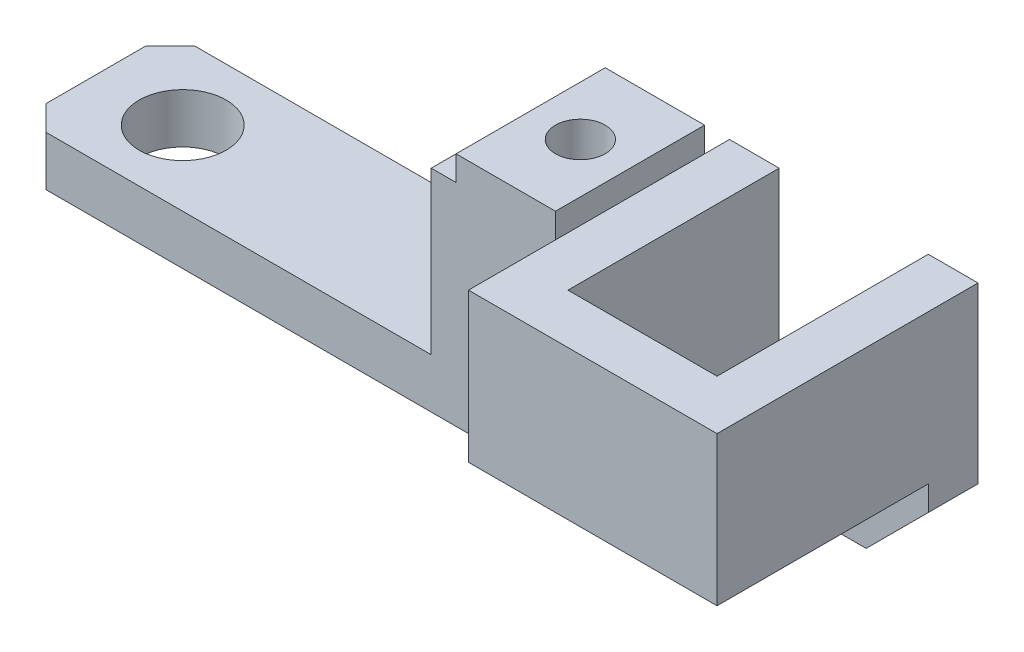
ISO-10303-21;
HEADER;
FILE_DESCRIPTION(('STEP AP214'),'2;1');
FILE_NAME('part.step','',(''),(''),'','','');
FILE_SCHEMA(('AUTOMOTIVE_DESIGN { 1 0 10303 214 1 1 1 1 }'));
ENDSEC;
DATA;
#1=APPLICATION_CONTEXT('core data for automotive mechanical design processes');
#2=APPLICATION_PROTOCOL_DEFINITION('international standard','automotive_design',2000,#1);
#3=PRODUCT_CONTEXT('',#1,'mechanical');
#4=PRODUCT('Part','Part','',(#3));
#5=PRODUCT_RELATED_PRODUCT_CATEGORY('part','',(#4));
#6=PRODUCT_DEFINITION_FORMATION('','',#4);
#7=PRODUCT_DEFINITION_CONTEXT('part definition',#1,'design');
#8=PRODUCT_DEFINITION('design','',#6,#7);
#9=PRODUCT_DEFINITION_SHAPE('','',#8);
#10=(LENGTH_UNIT() NAMED_UNIT(*) SI_UNIT(.MILLI.,.METRE.));
#11=(NAMED_UNIT(*) PLANE_ANGLE_UNIT() SI_UNIT($,.RADIAN.));
#12=(NAMED_UNIT(*) SI_UNIT($,.STERADIAN.) SOLID_ANGLE_UNIT());
#13=UNCERTAINTY_MEASURE_WITH_UNIT(LENGTH_MEASURE(1.E-05),#10,'distance_accuracy_value','');
#14=(GEOMETRIC_REPRESENTATION_CONTEXT(3) GLOBAL_UNCERTAINTY_ASSIGNED_CONTEXT((#13)) GLOBAL_UNIT_ASSIGNED_CONTEXT((#10,
#11,#12)) REPRESENTATION_CONTEXT('',''));
#15=CARTESIAN_POINT('',(0.,0.,0.));
#16=DIRECTION('',(0.,0.,1.));
#17=DIRECTION('',(1.,0.,0.));
#18=AXIS2_PLACEMENT_3D('',#15,#16,#17);
#19=CARTESIAN_POINT('',(0.,4.,-6.));
#20=DIRECTION('',(0.,0.,-1.));
#21=DIRECTION('',(-1.,0.,0.));
#22=AXIS2_PLACEMENT_3D('',#19,#20,#21);
#23=PLANE('',#22);
#24=CARTESIAN_POINT('',(32.5,4.,-6.));
#25=DIRECTION('',(0.,0.,1.));
#26=DIRECTION('',(1.,0.,0.));
#27=AXIS2_PLACEMENT_3D('',#24,#25,#26);
#28=CIRCLE('',#27,1.5);
#29=CARTESIAN_POINT('',(34.,4.,-6.));
#30=VERTEX_POINT('',#29);
#31=EDGE_CURVE('E433',#30,#30,#28,.T.);
#32=ORIENTED_EDGE('',*,*,#31,.T.);
#33=EDGE_LOOP('',(#32));
#34=FACE_BOUND('',#33,.T.);
#35=DIRECTION('',(0.,-1.,0.));
#36=VECTOR('',#35,1.);
#37=CARTESIAN_POINT('',(42.5,7.,-6.));
#38=LINE('',#37,#36);
#39=CARTESIAN_POINT('',(42.5,19.,-6.));
#40=VERTEX_POINT('',#39);
#41=CARTESIAN_POINT('',(42.5,4.99999999999995,-6.));
#42=VERTEX_POINT('',#41);
#43=EDGE_CURVE('E215',#40,#42,#38,.T.);
#44=ORIENTED_EDGE('',*,*,#43,.T.);
#45=DIRECTION('',(-0.707106781186552,-0.707106781186544,0.));
#46=VECTOR('',#45,1.);
#47=CARTESIAN_POINT('',(18.7499999999998,-18.75,-6.));
#48=LINE('',#47,#46);
#49=CARTESIAN_POINT('',(37.5,0.,-6.));
#50=VERTEX_POINT('',#49);
#51=EDGE_CURVE('E203',#42,#50,#48,.T.);
#52=ORIENTED_EDGE('',*,*,#51,.T.);
#53=DIRECTION('',(1.,0.,0.));
#54=VECTOR('',#53,1.);
#55=CARTESIAN_POINT('',(0.,0.,-6.));
#56=LINE('',#55,#54);
#57=CARTESIAN_POINT('',(-20.5,0.,-6.));
#58=VERTEX_POINT('',#57);
#59=EDGE_CURVE('E302',#58,#50,#56,.T.);
#60=ORIENTED_EDGE('',*,*,#59,.F.);
#61=DIRECTION('',(0.,1.,0.));
#62=VECTOR('',#61,1.);
#63=CARTESIAN_POINT('',(-20.5,4.,-6.));
#64=LINE('',#63,#62);
#65=CARTESIAN_POINT('',(-20.5,4.,-6.));
#66=VERTEX_POINT('',#65);
#67=EDGE_CURVE('E11',#58,#66,#64,.T.);
#68=ORIENTED_EDGE('',*,*,#67,.T.);
#69=DIRECTION('',(1.,0.,0.));
#70=VECTOR('',#69,1.);
#71=CARTESIAN_POINT('',(0.,4.,-6.));
#72=LINE('',#71,#70);
#73=CARTESIAN_POINT('',(10.5,4.,-6.));
#74=VERTEX_POINT('',#73);
#75=EDGE_CURVE('E294',#66,#74,#72,.T.);
#76=ORIENTED_EDGE('',*,*,#75,.T.);
#77=DIRECTION('',(0.,-1.,0.));
#78=VECTOR('',#77,1.);
#79=CARTESIAN_POINT('',(10.5,17.,-6.));
#80=LINE('',#79,#78);
#81=CARTESIAN_POINT('',(10.5,17.,-6.));
#82=VERTEX_POINT('',#81);
#83=EDGE_CURVE('E285',#82,#74,#80,.T.);
#84=ORIENTED_EDGE('',*,*,#83,.F.);
#85=DIRECTION('',(1.,0.,0.));
#86=VECTOR('',#85,1.);
#87=CARTESIAN_POINT('',(0.,17.,-6.));
#88=LINE('',#87,#86);
#89=CARTESIAN_POINT('',(12.5,17.,-6.));
#90=VERTEX_POINT('',#89);
#91=EDGE_CURVE('E271',#82,#90,#88,.T.);
#92=ORIENTED_EDGE('',*,*,#91,.T.);
#93=DIRECTION('',(0.,-1.,0.));
#94=VECTOR('',#93,1.);
#95=CARTESIAN_POINT('',(12.5,19.,-6.));
#96=LINE('',#95,#94);
#97=CARTESIAN_POINT('',(12.5,19.,-6.));
#98=VERTEX_POINT('',#97);
#99=EDGE_CURVE('E268',#98,#90,#96,.T.);
#100=ORIENTED_EDGE('',*,*,#99,.F.);
#101=DIRECTION('',(1.,0.,0.));
#102=VECTOR('',#101,1.);
#103=CARTESIAN_POINT('',(0.,19.,-6.));
#104=LINE('',#103,#102);
#105=CARTESIAN_POINT('',(20.5,19.,-6.));
#106=VERTEX_POINT('',#105);
#107=EDGE_CURVE('E250',#98,#106,#104,.T.);
#108=ORIENTED_EDGE('',*,*,#107,.T.);
#109=DIRECTION('',(0.,-1.,0.));
#110=VECTOR('',#109,1.);
#111=CARTESIAN_POINT('',(20.5,19.,-6.));
#112=LINE('',#111,#110);
#113=CARTESIAN_POINT('',(20.5,17.,-6.));
#114=VERTEX_POINT('',#113);
#115=EDGE_CURVE('E256',#106,#114,#112,.T.);
#116=ORIENTED_EDGE('',*,*,#115,.T.);
#117=DIRECTION('',(1.,0.,0.));
#118=VECTOR('',#117,1.);
#119=CARTESIAN_POINT('',(0.,17.,-6.));
#120=LINE('',#119,#118);
#121=CARTESIAN_POINT('',(22.5,17.,-6.));
#122=VERTEX_POINT('',#121);
#123=EDGE_CURVE('E231',#114,#122,#120,.T.);
#124=ORIENTED_EDGE('',*,*,#123,.T.);
#125=DIRECTION('',(0.,-1.,0.));
#126=VECTOR('',#125,1.);
#127=CARTESIAN_POINT('',(22.5,48.,-6.));
#128=LINE('',#127,#126);
#129=CARTESIAN_POINT('',(22.5,19.,-6.));
#130=VERTEX_POINT('',#129);
#131=EDGE_CURVE('E399',#130,#122,#128,.T.);
#132=ORIENTED_EDGE('',*,*,#131,.F.);
#133=DIRECTION('',(-1.,0.,0.));
#134=VECTOR('',#133,1.);
#135=CARTESIAN_POINT('',(22.5,19.,-6.));
#136=LINE('',#135,#134);
#137=CARTESIAN_POINT('',(26.5,19.,-6.));
#138=VERTEX_POINT('',#137);
#139=EDGE_CURVE('E418',#138,#130,#136,.T.);
#140=ORIENTED_EDGE('',*,*,#139,.F.);
#141=DIRECTION('',(0.,-1.,0.));
#142=VECTOR('',#141,1.);
#143=CARTESIAN_POINT('',(26.5,48.,-6.));
#144=LINE('',#143,#142);
#145=CARTESIAN_POINT('',(26.5,7.,-6.));
#146=VERTEX_POINT('',#145);
#147=EDGE_CURVE('E420',#138,#146,#144,.T.);
#148=ORIENTED_EDGE('',*,*,#147,.T.);
#149=DIRECTION('',(1.,0.,0.));
#150=VECTOR('',#149,1.);
#151=CARTESIAN_POINT('',(0.,7.,-6.));
#152=LINE('',#151,#150);
#153=CARTESIAN_POINT('',(38.5,7.,-6.));
#154=VERTEX_POINT('',#153);
#155=EDGE_CURVE('E352',#146,#154,#152,.T.);
#156=ORIENTED_EDGE('',*,*,#155,.T.);
#157=DIRECTION('',(0.,-1.,0.));
#158=VECTOR('',#157,1.);
#159=CARTESIAN_POINT('',(38.5,48.,-6.));
#160=LINE('',#159,#158);
#161=CARTESIAN_POINT('',(38.5,19.,-6.));
#162=VERTEX_POINT('',#161);
#163=EDGE_CURVE('E387',#162,#154,#160,.T.);
#164=ORIENTED_EDGE('',*,*,#163,.F.);
#165=DIRECTION('',(-1.,0.,0.));
#166=VECTOR('',#165,1.);
#167=CARTESIAN_POINT('',(38.5,19.,-6.));
#168=LINE('',#167,#166);
#169=EDGE_CURVE('E218',#40,#162,#168,.T.);
#170=ORIENTED_EDGE('',*,*,#169,.F.);
#171=EDGE_LOOP('',(#44,#52,#60,#68,#76,#84,#92,#100,#108,#116,#124,#132,#140,#148,#156,#164,#170));
#172=FACE_BOUND('',#171,.T.);
#173=ADVANCED_FACE('F44',(#34,#172),#23,.T.);
#174=CARTESIAN_POINT('',(0.,7.,-2.));
#175=DIRECTION('',(0.,0.,-1.));
#176=DIRECTION('',(-1.,0.,0.));
#177=AXIS2_PLACEMENT_3D('',#174,#175,#176);
#178=PLANE('',#177);
#179=CARTESIAN_POINT('',(32.5,4.,-2.));
#180=DIRECTION('',(0.,0.,1.));
#181=DIRECTION('',(1.,0.,0.));
#182=AXIS2_PLACEMENT_3D('',#179,#180,#181);
#183=CIRCLE('',#182,1.5);
#184=CARTESIAN_POINT('',(34.,4.,-2.));
#185=VERTEX_POINT('',#184);
#186=EDGE_CURVE('E348',#185,#185,#183,.T.);
#187=ORIENTED_EDGE('',*,*,#186,.F.);
#188=EDGE_LOOP('',(#187));
#189=FACE_BOUND('',#188,.T.);
#190=DIRECTION('',(-0.707106781186552,-0.707106781186544,0.));
#191=VECTOR('',#190,1.);
#192=CARTESIAN_POINT('',(18.7499999999998,-18.75,-2.));
#193=LINE('',#192,#191);
#194=CARTESIAN_POINT('',(42.5,4.99999999999995,-2.));
#195=VERTEX_POINT('',#194);
#196=CARTESIAN_POINT('',(37.5,0.,-2.));
#197=VERTEX_POINT('',#196);
#198=EDGE_CURVE('E210',#195,#197,#193,.T.);
#199=ORIENTED_EDGE('',*,*,#198,.F.);
#200=DIRECTION('',(0.,-1.,0.));
#201=VECTOR('',#200,1.);
#202=CARTESIAN_POINT('',(42.5,7.,-2.));
#203=LINE('',#202,#201);
#204=CARTESIAN_POINT('',(42.5,7.,-2.));
#205=VERTEX_POINT('',#204);
#206=EDGE_CURVE('E214',#205,#195,#203,.T.);
#207=ORIENTED_EDGE('',*,*,#206,.F.);
#208=DIRECTION('',(1.,0.,0.));
#209=VECTOR('',#208,1.);
#210=CARTESIAN_POINT('',(0.,7.,-2.));
#211=LINE('',#210,#209);
#212=CARTESIAN_POINT('',(38.5,7.,-2.));
#213=VERTEX_POINT('',#212);
#214=EDGE_CURVE('E357',#213,#205,#211,.T.);
#215=ORIENTED_EDGE('',*,*,#214,.F.);
#216=CARTESIAN_POINT('',(26.5,7.,-2.));
#217=VERTEX_POINT('',#216);
#218=EDGE_CURVE('E370',#217,#213,#211,.T.);
#219=ORIENTED_EDGE('',*,*,#218,.F.);
#220=CARTESIAN_POINT('',(22.5,7.,-2.));
#221=VERTEX_POINT('',#220);
#222=EDGE_CURVE('E364',#221,#217,#211,.T.);
#223=ORIENTED_EDGE('',*,*,#222,.F.);
#224=DIRECTION('',(0.,-1.,0.));
#225=VECTOR('',#224,1.);
#226=CARTESIAN_POINT('',(22.5,7.,-2.));
#227=LINE('',#226,#225);
#228=CARTESIAN_POINT('',(22.5,0.,-2.));
#229=VERTEX_POINT('',#228);
#230=EDGE_CURVE('E225',#221,#229,#227,.T.);
#231=ORIENTED_EDGE('',*,*,#230,.T.);
#232=DIRECTION('',(1.,0.,0.));
#233=VECTOR('',#232,1.);
#234=CARTESIAN_POINT('',(0.,0.,-2.));
#235=LINE('',#234,#233);
#236=EDGE_CURVE('E349',#229,#197,#235,.T.);
#237=ORIENTED_EDGE('',*,*,#236,.T.);
#238=EDGE_LOOP('',(#199,#207,#215,#219,#223,#231,#237));
#239=FACE_BOUND('',#238,.T.);
#240=ADVANCED_FACE('F355',(#189,#239),#178,.F.);
#241=CARTESIAN_POINT('',(22.5,17.,0.));
#242=DIRECTION('',(-1.,0.,0.));
#243=DIRECTION('',(0.,0.,1.));
#244=AXIS2_PLACEMENT_3D('',#241,#242,#243);
#245=PLANE('',#244);
#246=ORIENTED_EDGE('',*,*,#230,.F.);
#247=DIRECTION('',(0.,0.,1.));
#248=VECTOR('',#247,1.);
#249=CARTESIAN_POINT('',(22.5,7.,-6.));
#250=LINE('',#249,#248);
#251=CARTESIAN_POINT('',(22.5,7.,6.));
#252=VERTEX_POINT('',#251);
#253=EDGE_CURVE('E397',#221,#252,#250,.T.);
#254=ORIENTED_EDGE('',*,*,#253,.T.);
#255=DIRECTION('',(0.,-1.,0.));
#256=VECTOR('',#255,1.);
#257=CARTESIAN_POINT('',(22.5,17.,6.));
#258=LINE('',#257,#256);
#259=CARTESIAN_POINT('',(22.5,0.,6.));
#260=VERTEX_POINT('',#259);
#261=EDGE_CURVE('E236',#252,#260,#258,.T.);
#262=ORIENTED_EDGE('',*,*,#261,.T.);
#263=DIRECTION('',(0.,0.,-1.));
#264=VECTOR('',#263,1.);
#265=CARTESIAN_POINT('',(22.5,0.,0.));
#266=LINE('',#265,#264);
#267=EDGE_CURVE('E222',#260,#229,#266,.T.);
#268=ORIENTED_EDGE('',*,*,#267,.T.);
#269=EDGE_LOOP('',(#246,#254,#262,#268));
#270=FACE_BOUND('',#269,.T.);
#271=ADVANCED_FACE('F472',(#270),#245,.F.);
#272=CARTESIAN_POINT('',(-22.5,4.,0.));
#273=DIRECTION('',(-1.,0.,0.));
#274=DIRECTION('',(0.,0.,1.));
#275=AXIS2_PLACEMENT_3D('',#272,#273,#274);
#276=PLANE('',#275);
#277=DIRECTION('',(0.,0.,-1.));
#278=VECTOR('',#277,1.);
#279=CARTESIAN_POINT('',(-22.5,0.,0.));
#280=LINE('',#279,#278);
#281=CARTESIAN_POINT('',(-22.5,0.,3.99999999999999));
#282=VERTEX_POINT('',#281);
#283=CARTESIAN_POINT('',(-22.5,0.,-3.99999999999999));
#284=VERTEX_POINT('',#283);
#285=EDGE_CURVE('E308',#282,#284,#280,.T.);
#286=ORIENTED_EDGE('',*,*,#285,.F.);
#287=DIRECTION('',(0.,1.,0.));
#288=VECTOR('',#287,1.);
#289=CARTESIAN_POINT('',(-22.5,4.,3.99999999999999));
#290=LINE('',#289,#288);
#291=CARTESIAN_POINT('',(-22.5,4.,3.99999999999999));
#292=VERTEX_POINT('',#291);
#293=EDGE_CURVE('E317',#282,#292,#290,.T.);
#294=ORIENTED_EDGE('',*,*,#293,.T.);
#295=DIRECTION('',(0.,0.,-1.));
#296=VECTOR('',#295,1.);
#297=CARTESIAN_POINT('',(-22.5,4.,0.));
#298=LINE('',#297,#296);
#299=CARTESIAN_POINT('',(-22.5,4.,-3.99999999999999));
#300=VERTEX_POINT('',#299);
#301=EDGE_CURVE('E299',#292,#300,#298,.T.);
#302=ORIENTED_EDGE('',*,*,#301,.T.);
#303=DIRECTION('',(0.,-1.,0.));
#304=VECTOR('',#303,1.);
#305=CARTESIAN_POINT('',(-22.5,4.,-3.99999999999999));
#306=LINE('',#305,#304);
#307=EDGE_CURVE('E316',#300,#284,#306,.T.);
#308=ORIENTED_EDGE('',*,*,#307,.T.);
#309=EDGE_LOOP('',(#286,#294,#302,#308));
#310=FACE_BOUND('',#309,.T.);
#311=ADVANCED_FACE('F341',(#310),#276,.T.);
#312=CARTESIAN_POINT('',(-15.5,4.,0.));
#313=DIRECTION('',(0.,-1.,0.));
#314=DIRECTION('',(0.,0.,-1.));
#315=AXIS2_PLACEMENT_3D('',#312,#313,#314);
#316=CYLINDRICAL_SURFACE('',#315,3.5);
#317=CARTESIAN_POINT('',(-15.5,4.,0.));
#318=DIRECTION('',(0.,1.,0.));
#319=DIRECTION('',(0.,0.,1.));
#320=AXIS2_PLACEMENT_3D('',#317,#318,#319);
#321=CIRCLE('',#320,3.5);
#322=CARTESIAN_POINT('',(-15.5,4.,3.5));
#323=VERTEX_POINT('',#322);
#324=EDGE_CURVE('E290',#323,#323,#321,.T.);
#325=ORIENTED_EDGE('',*,*,#324,.T.);
#326=EDGE_LOOP('',(#325));
#327=FACE_BOUND('',#326,.T.);
#328=CARTESIAN_POINT('',(-15.5,0.,0.));
#329=DIRECTION('',(0.,1.,0.));
#330=DIRECTION('',(0.,0.,1.));
#331=AXIS2_PLACEMENT_3D('',#328,#329,#330);
#332=CIRCLE('',#331,3.5);
#333=CARTESIAN_POINT('',(-15.5,0.,3.5));
#334=VERTEX_POINT('',#333);
#335=EDGE_CURVE('E288',#334,#334,#332,.T.);
#336=ORIENTED_EDGE('',*,*,#335,.F.);
#337=EDGE_LOOP('',(#336));
#338=FACE_BOUND('',#337,.T.);
#339=ADVANCED_FACE('F477',(#327,#338),#316,.F.);
#340=CARTESIAN_POINT('',(0.,4.,6.));
#341=DIRECTION('',(0.,0.,-1.));
#342=DIRECTION('',(-1.,0.,0.));
#343=AXIS2_PLACEMENT_3D('',#340,#341,#342);
#344=PLANE('',#343);
#345=DIRECTION('',(1.,0.,0.));
#346=VECTOR('',#345,1.);
#347=CARTESIAN_POINT('',(0.,4.,6.));
#348=LINE('',#347,#346);
#349=CARTESIAN_POINT('',(-20.5,4.,6.));
#350=VERTEX_POINT('',#349);
#351=CARTESIAN_POINT('',(10.5,4.,6.));
#352=VERTEX_POINT('',#351);
#353=EDGE_CURVE('E298',#350,#352,#348,.T.);
#354=ORIENTED_EDGE('',*,*,#353,.F.);
#355=DIRECTION('',(0.,-1.,0.));
#356=VECTOR('',#355,1.);
#357=CARTESIAN_POINT('',(-20.5,0.,6.));
#358=LINE('',#357,#356);
#359=CARTESIAN_POINT('',(-20.5,0.,6.));
#360=VERTEX_POINT('',#359);
#361=EDGE_CURVE('E303',#350,#360,#358,.T.);
#362=ORIENTED_EDGE('',*,*,#361,.T.);
#363=DIRECTION('',(1.,0.,0.));
#364=VECTOR('',#363,1.);
#365=CARTESIAN_POINT('',(0.,0.,6.));
#366=LINE('',#365,#364);
#367=EDGE_CURVE('E292',#360,#260,#366,.T.);
#368=ORIENTED_EDGE('',*,*,#367,.T.);
#369=ORIENTED_EDGE('',*,*,#261,.F.);
#370=CARTESIAN_POINT('',(22.5,17.,6.));
#371=VERTEX_POINT('',#370);
#372=EDGE_CURVE('E238',#371,#252,#258,.T.);
#373=ORIENTED_EDGE('',*,*,#372,.F.);
#374=DIRECTION('',(1.,0.,0.));
#375=VECTOR('',#374,1.);
#376=CARTESIAN_POINT('',(0.,17.,6.));
#377=LINE('',#376,#375);
#378=CARTESIAN_POINT('',(20.5,17.,6.));
#379=VERTEX_POINT('',#378);
#380=EDGE_CURVE('E223',#379,#371,#377,.T.);
#381=ORIENTED_EDGE('',*,*,#380,.F.);
#382=DIRECTION('',(0.,-1.,0.));
#383=VECTOR('',#382,1.);
#384=CARTESIAN_POINT('',(20.5,19.,6.));
#385=LINE('',#384,#383);
#386=CARTESIAN_POINT('',(20.5,19.,6.));
#387=VERTEX_POINT('',#386);
#388=EDGE_CURVE('E263',#387,#379,#385,.T.);
#389=ORIENTED_EDGE('',*,*,#388,.F.);
#390=DIRECTION('',(1.,0.,0.));
#391=VECTOR('',#390,1.);
#392=CARTESIAN_POINT('',(0.,19.,6.));
#393=LINE('',#392,#391);
#394=CARTESIAN_POINT('',(12.5,19.,6.));
#395=VERTEX_POINT('',#394);
#396=EDGE_CURVE('E251',#395,#387,#393,.T.);
#397=ORIENTED_EDGE('',*,*,#396,.F.);
#398=DIRECTION('',(0.,-1.,0.));
#399=VECTOR('',#398,1.);
#400=CARTESIAN_POINT('',(12.5,19.,6.));
#401=LINE('',#400,#399);
#402=CARTESIAN_POINT('',(12.5,17.,6.));
#403=VERTEX_POINT('',#402);
#404=EDGE_CURVE('E264',#395,#403,#401,.T.);
#405=ORIENTED_EDGE('',*,*,#404,.T.);
#406=DIRECTION('',(1.,0.,0.));
#407=VECTOR('',#406,1.);
#408=CARTESIAN_POINT('',(0.,17.,6.));
#409=LINE('',#408,#407);
#410=CARTESIAN_POINT('',(10.5,17.,6.));
#411=VERTEX_POINT('',#410);
#412=EDGE_CURVE('E274',#411,#403,#409,.T.);
#413=ORIENTED_EDGE('',*,*,#412,.F.);
#414=DIRECTION('',(0.,-1.,0.));
#415=VECTOR('',#414,1.);
#416=CARTESIAN_POINT('',(10.5,17.,6.));
#417=LINE('',#416,#415);
#418=EDGE_CURVE('E278',#411,#352,#417,.T.);
#419=ORIENTED_EDGE('',*,*,#418,.T.);
#420=EDGE_LOOP('',(#354,#362,#368,#369,#373,#381,#389,#397,#405,#413,#419));
#421=FACE_BOUND('',#420,.T.);
#422=ADVANCED_FACE('F335',(#421),#344,.F.);
#423=CARTESIAN_POINT('',(0.,4.,0.));
#424=DIRECTION('',(0.,1.,0.));
#425=DIRECTION('',(0.,0.,1.));
#426=AXIS2_PLACEMENT_3D('',#423,#424,#425);
#427=PLANE('',#426);
#428=ORIENTED_EDGE('',*,*,#324,.F.);
#429=EDGE_LOOP('',(#428));
#430=FACE_BOUND('',#429,.T.);
#431=ORIENTED_EDGE('',*,*,#301,.F.);
#432=DIRECTION('',(0.707106781186546,0.,0.707106781186549));
#433=VECTOR('',#432,1.);
#434=CARTESIAN_POINT('',(-13.25,4.,13.25));
#435=LINE('',#434,#433);
#436=EDGE_CURVE('E53',#292,#350,#435,.T.);
#437=ORIENTED_EDGE('',*,*,#436,.T.);
#438=ORIENTED_EDGE('',*,*,#353,.T.);
#439=DIRECTION('',(0.,0.,1.));
#440=VECTOR('',#439,1.);
#441=CARTESIAN_POINT('',(10.5,4.,0.));
#442=LINE('',#441,#440);
#443=EDGE_CURVE('E289',#74,#352,#442,.T.);
#444=ORIENTED_EDGE('',*,*,#443,.F.);
#445=ORIENTED_EDGE('',*,*,#75,.F.);
#446=DIRECTION('',(0.707106781186549,0.,-0.707106781186546));
#447=VECTOR('',#446,1.);
#448=CARTESIAN_POINT('',(-13.25,4.,-13.25));
#449=LINE('',#448,#447);
#450=EDGE_CURVE('E321',#66,#300,#449,.F.);
#451=ORIENTED_EDGE('',*,*,#450,.T.);
#452=EDGE_LOOP('',(#431,#437,#438,#444,#445,#451));
#453=FACE_BOUND('',#452,.T.);
#454=ADVANCED_FACE('F326',(#430,#453),#427,.T.);
#455=CARTESIAN_POINT('',(0.,0.,0.));
#456=DIRECTION('',(0.,1.,0.));
#457=DIRECTION('',(0.,0.,1.));
#458=AXIS2_PLACEMENT_3D('',#455,#456,#457);
#459=PLANE('',#458);
#460=ORIENTED_EDGE('',*,*,#335,.T.);
#461=EDGE_LOOP('',(#460));
#462=FACE_BOUND('',#461,.T.);
#463=ORIENTED_EDGE('',*,*,#59,.T.);
#464=DIRECTION('',(0.,0.,1.));
#465=VECTOR('',#464,1.);
#466=CARTESIAN_POINT('',(37.5,0.,-6.));
#467=LINE('',#466,#465);
#468=EDGE_CURVE('E204',#50,#197,#467,.T.);
#469=ORIENTED_EDGE('',*,*,#468,.T.);
#470=ORIENTED_EDGE('',*,*,#236,.F.);
#471=ORIENTED_EDGE('',*,*,#267,.F.);
#472=ORIENTED_EDGE('',*,*,#367,.F.);
#473=DIRECTION('',(-0.707106781186546,0.,-0.707106781186549));
#474=VECTOR('',#473,1.);
#475=CARTESIAN_POINT('',(-20.5,0.,6.));
#476=LINE('',#475,#474);
#477=EDGE_CURVE('E314',#360,#282,#476,.T.);
#478=ORIENTED_EDGE('',*,*,#477,.T.);
#479=ORIENTED_EDGE('',*,*,#285,.T.);
#480=DIRECTION('',(-0.707106781186549,0.,0.707106781186546));
#481=VECTOR('',#480,1.);
#482=CARTESIAN_POINT('',(-22.5,0.,-3.99999999999999));
#483=LINE('',#482,#481);
#484=EDGE_CURVE('E315',#284,#58,#483,.F.);
#485=ORIENTED_EDGE('',*,*,#484,.T.);
#486=EDGE_LOOP('',(#463,#469,#470,#471,#472,#478,#479,#485));
#487=FACE_BOUND('',#486,.T.);
#488=CARTESIAN_POINT('',(16.5,0.,0.));
#489=DIRECTION('',(0.,1.,0.));
#490=DIRECTION('',(0.,0.,1.));
#491=AXIS2_PLACEMENT_3D('',#488,#489,#490);
#492=CIRCLE('',#491,2.);
#493=CARTESIAN_POINT('',(16.5,0.,2.));
#494=VERTEX_POINT('',#493);
#495=EDGE_CURVE('E245',#494,#494,#492,.T.);
#496=ORIENTED_EDGE('',*,*,#495,.T.);
#497=EDGE_LOOP('',(#496));
#498=FACE_BOUND('',#497,.T.);
#499=ADVANCED_FACE('F338',(#462,#487,#498),#459,.F.);
#500=CARTESIAN_POINT('',(10.5,17.,0.));
#501=DIRECTION('',(1.,0.,0.));
#502=DIRECTION('',(0.,0.,-1.));
#503=AXIS2_PLACEMENT_3D('',#500,#501,#502);
#504=PLANE('',#503);
#505=ORIENTED_EDGE('',*,*,#83,.T.);
#506=ORIENTED_EDGE('',*,*,#443,.T.);
#507=ORIENTED_EDGE('',*,*,#418,.F.);
#508=DIRECTION('',(0.,0.,1.));
#509=VECTOR('',#508,1.);
#510=CARTESIAN_POINT('',(10.5,17.,0.));
#511=LINE('',#510,#509);
#512=EDGE_CURVE('E272',#82,#411,#511,.T.);
#513=ORIENTED_EDGE('',*,*,#512,.F.);
#514=EDGE_LOOP('',(#505,#506,#507,#513));
#515=FACE_BOUND('',#514,.T.);
#516=ADVANCED_FACE('F540',(#515),#504,.F.);
#517=CARTESIAN_POINT('',(0.,17.,0.));
#518=DIRECTION('',(0.,1.,0.));
#519=DIRECTION('',(0.,0.,1.));
#520=AXIS2_PLACEMENT_3D('',#517,#518,#519);
#521=PLANE('',#520);
#522=ORIENTED_EDGE('',*,*,#91,.F.);
#523=ORIENTED_EDGE('',*,*,#512,.T.);
#524=ORIENTED_EDGE('',*,*,#412,.T.);
#525=DIRECTION('',(0.,0.,1.));
#526=VECTOR('',#525,1.);
#527=CARTESIAN_POINT('',(12.5,17.,0.));
#528=LINE('',#527,#526);
#529=EDGE_CURVE('E280',#90,#403,#528,.T.);
#530=ORIENTED_EDGE('',*,*,#529,.F.);
#531=EDGE_LOOP('',(#522,#523,#524,#530));
#532=FACE_BOUND('',#531,.T.);
#533=ADVANCED_FACE('F534',(#532),#521,.T.);
#534=CARTESIAN_POINT('',(12.5,19.,0.));
#535=DIRECTION('',(1.,0.,0.));
#536=DIRECTION('',(0.,0.,-1.));
#537=AXIS2_PLACEMENT_3D('',#534,#535,#536);
#538=PLANE('',#537);
#539=ORIENTED_EDGE('',*,*,#99,.T.);
#540=ORIENTED_EDGE('',*,*,#529,.T.);
#541=ORIENTED_EDGE('',*,*,#404,.F.);
#542=DIRECTION('',(0.,0.,1.));
#543=VECTOR('',#542,1.);
#544=CARTESIAN_POINT('',(12.5,19.,0.));
#545=LINE('',#544,#543);
#546=EDGE_CURVE('E249',#98,#395,#545,.T.);
#547=ORIENTED_EDGE('',*,*,#546,.F.);
#548=EDGE_LOOP('',(#539,#540,#541,#547));
#549=FACE_BOUND('',#548,.T.);
#550=ADVANCED_FACE('F529',(#549),#538,.F.);
#551=CARTESIAN_POINT('',(16.5,19.,0.));
#552=DIRECTION('',(0.,-1.,0.));
#553=DIRECTION('',(0.,0.,-1.));
#554=AXIS2_PLACEMENT_3D('',#551,#552,#553);
#555=CYLINDRICAL_SURFACE('',#554,2.);
#556=CARTESIAN_POINT('',(16.5,19.,0.));
#557=DIRECTION('',(0.,1.,0.));
#558=DIRECTION('',(0.,0.,1.));
#559=AXIS2_PLACEMENT_3D('',#556,#557,#558);
#560=CIRCLE('',#559,2.);
#561=CARTESIAN_POINT('',(16.5,19.,2.));
#562=VERTEX_POINT('',#561);
#563=EDGE_CURVE('E243',#562,#562,#560,.T.);
#564=ORIENTED_EDGE('',*,*,#563,.T.);
#565=EDGE_LOOP('',(#564));
#566=FACE_BOUND('',#565,.T.);
#567=ORIENTED_EDGE('',*,*,#495,.F.);
#568=EDGE_LOOP('',(#567));
#569=FACE_BOUND('',#568,.T.);
#570=ADVANCED_FACE('F602',(#566,#569),#555,.F.);
#571=CARTESIAN_POINT('',(20.5,19.,0.));
#572=DIRECTION('',(1.,0.,0.));
#573=DIRECTION('',(0.,0.,-1.));
#574=AXIS2_PLACEMENT_3D('',#571,#572,#573);
#575=PLANE('',#574);
#576=DIRECTION('',(0.,0.,1.));
#577=VECTOR('',#576,1.);
#578=CARTESIAN_POINT('',(20.5,17.,0.));
#579=LINE('',#578,#577);
#580=EDGE_CURVE('E237',#114,#379,#579,.T.);
#581=ORIENTED_EDGE('',*,*,#580,.F.);
#582=ORIENTED_EDGE('',*,*,#115,.F.);
#583=DIRECTION('',(0.,0.,1.));
#584=VECTOR('',#583,1.);
#585=CARTESIAN_POINT('',(20.5,19.,0.));
#586=LINE('',#585,#584);
#587=EDGE_CURVE('E254',#106,#387,#586,.T.);
#588=ORIENTED_EDGE('',*,*,#587,.T.);
#589=ORIENTED_EDGE('',*,*,#388,.T.);
#590=EDGE_LOOP('',(#581,#582,#588,#589));
#591=FACE_BOUND('',#590,.T.);
#592=ADVANCED_FACE('F523',(#591),#575,.T.);
#593=CARTESIAN_POINT('',(0.,19.,0.));
#594=DIRECTION('',(0.,1.,0.));
#595=DIRECTION('',(0.,0.,1.));
#596=AXIS2_PLACEMENT_3D('',#593,#594,#595);
#597=PLANE('',#596);
#598=ORIENTED_EDGE('',*,*,#563,.F.);
#599=EDGE_LOOP('',(#598));
#600=FACE_BOUND('',#599,.T.);
#601=ORIENTED_EDGE('',*,*,#107,.F.);
#602=ORIENTED_EDGE('',*,*,#546,.T.);
#603=ORIENTED_EDGE('',*,*,#396,.T.);
#604=ORIENTED_EDGE('',*,*,#587,.F.);
#605=EDGE_LOOP('',(#601,#602,#603,#604));
#606=FACE_BOUND('',#605,.T.);
#607=ADVANCED_FACE('F516',(#600,#606),#597,.T.);
#608=CARTESIAN_POINT('',(0.,17.,0.));
#609=DIRECTION('',(0.,1.,0.));
#610=DIRECTION('',(0.,0.,1.));
#611=AXIS2_PLACEMENT_3D('',#608,#609,#610);
#612=PLANE('',#611);
#613=ORIENTED_EDGE('',*,*,#380,.T.);
#614=DIRECTION('',(0.,0.,-1.));
#615=VECTOR('',#614,1.);
#616=CARTESIAN_POINT('',(22.5,17.,0.));
#617=LINE('',#616,#615);
#618=EDGE_CURVE('E233',#371,#122,#617,.T.);
#619=ORIENTED_EDGE('',*,*,#618,.T.);
#620=ORIENTED_EDGE('',*,*,#123,.F.);
#621=ORIENTED_EDGE('',*,*,#580,.T.);
#622=EDGE_LOOP('',(#613,#619,#620,#621));
#623=FACE_BOUND('',#622,.T.);
#624=ADVANCED_FACE('F519',(#623),#612,.T.);
#625=CARTESIAN_POINT('',(42.5,7.,0.));
#626=DIRECTION('',(1.,0.,0.));
#627=DIRECTION('',(0.,0.,-1.));
#628=AXIS2_PLACEMENT_3D('',#625,#626,#627);
#629=PLANE('',#628);
#630=DIRECTION('',(0.,0.,1.));
#631=VECTOR('',#630,1.);
#632=CARTESIAN_POINT('',(42.5,4.99999999999995,-6.));
#633=LINE('',#632,#631);
#634=EDGE_CURVE('E64',#42,#195,#633,.T.);
#635=ORIENTED_EDGE('',*,*,#634,.F.);
#636=ORIENTED_EDGE('',*,*,#43,.F.);
#637=DIRECTION('',(0.,0.,-1.));
#638=VECTOR('',#637,1.);
#639=CARTESIAN_POINT('',(42.5,19.,-6.));
#640=LINE('',#639,#638);
#641=CARTESIAN_POINT('',(42.5,19.,15.));
#642=VERTEX_POINT('',#641);
#643=EDGE_CURVE('E410',#642,#40,#640,.T.);
#644=ORIENTED_EDGE('',*,*,#643,.F.);
#645=DIRECTION('',(0.,-1.,0.));
#646=VECTOR('',#645,1.);
#647=CARTESIAN_POINT('',(42.5,48.,15.));
#648=LINE('',#647,#646);
#649=CARTESIAN_POINT('',(42.5,7.,15.));
#650=VERTEX_POINT('',#649);
#651=EDGE_CURVE('E383',#642,#650,#648,.T.);
#652=ORIENTED_EDGE('',*,*,#651,.T.);
#653=DIRECTION('',(0.,0.,-1.));
#654=VECTOR('',#653,1.);
#655=CARTESIAN_POINT('',(42.5,7.,-6.));
#656=LINE('',#655,#654);
#657=EDGE_CURVE('E378',#650,#205,#656,.T.);
#658=ORIENTED_EDGE('',*,*,#657,.T.);
#659=ORIENTED_EDGE('',*,*,#206,.T.);
#660=EDGE_LOOP('',(#635,#636,#644,#652,#658,#659));
#661=FACE_BOUND('',#660,.T.);
#662=ADVANCED_FACE('F211',(#661),#629,.T.);
#663=CARTESIAN_POINT('',(0.,7.,0.));
#664=DIRECTION('',(0.,1.,0.));
#665=DIRECTION('',(0.,0.,1.));
#666=AXIS2_PLACEMENT_3D('',#663,#664,#665);
#667=PLANE('',#666);
#668=DIRECTION('',(0.,0.,-1.));
#669=VECTOR('',#668,1.);
#670=CARTESIAN_POINT('',(26.5,7.,-6.));
#671=LINE('',#670,#669);
#672=EDGE_CURVE('E428',#217,#146,#671,.T.);
#673=ORIENTED_EDGE('',*,*,#672,.F.);
#674=ORIENTED_EDGE('',*,*,#218,.T.);
#675=DIRECTION('',(0.,0.,1.));
#676=VECTOR('',#675,1.);
#677=CARTESIAN_POINT('',(38.5,7.,-2.));
#678=LINE('',#677,#676);
#679=EDGE_CURVE('E393',#154,#213,#678,.T.);
#680=ORIENTED_EDGE('',*,*,#679,.F.);
#681=ORIENTED_EDGE('',*,*,#155,.F.);
#682=EDGE_LOOP('',(#673,#674,#680,#681));
#683=FACE_BOUND('',#682,.T.);
#684=ADVANCED_FACE('F459',(#683),#667,.T.);
#685=CARTESIAN_POINT('',(0.,7.,0.));
#686=DIRECTION('',(0.,1.,0.));
#687=DIRECTION('',(0.,0.,1.));
#688=AXIS2_PLACEMENT_3D('',#685,#686,#687);
#689=PLANE('',#688);
#690=ORIENTED_EDGE('',*,*,#253,.F.);
#691=ORIENTED_EDGE('',*,*,#222,.T.);
#692=CARTESIAN_POINT('',(26.5,7.,11.));
#693=VERTEX_POINT('',#692);
#694=EDGE_CURVE('E431',#693,#217,#671,.T.);
#695=ORIENTED_EDGE('',*,*,#694,.F.);
#696=DIRECTION('',(-1.,0.,0.));
#697=VECTOR('',#696,1.);
#698=CARTESIAN_POINT('',(26.5,7.,11.));
#699=LINE('',#698,#697);
#700=CARTESIAN_POINT('',(38.5,7.,11.));
#701=VERTEX_POINT('',#700);
#702=EDGE_CURVE('E422',#701,#693,#699,.T.);
#703=ORIENTED_EDGE('',*,*,#702,.F.);
#704=EDGE_CURVE('E379',#213,#701,#678,.T.);
#705=ORIENTED_EDGE('',*,*,#704,.F.);
#706=ORIENTED_EDGE('',*,*,#214,.T.);
#707=ORIENTED_EDGE('',*,*,#657,.F.);
#708=DIRECTION('',(1.,0.,0.));
#709=VECTOR('',#708,1.);
#710=CARTESIAN_POINT('',(22.5,7.,15.));
#711=LINE('',#710,#709);
#712=CARTESIAN_POINT('',(22.5,7.,15.));
#713=VERTEX_POINT('',#712);
#714=EDGE_CURVE('E388',#713,#650,#711,.T.);
#715=ORIENTED_EDGE('',*,*,#714,.F.);
#716=EDGE_CURVE('E396',#252,#713,#250,.T.);
#717=ORIENTED_EDGE('',*,*,#716,.F.);
#718=EDGE_LOOP('',(#690,#691,#695,#703,#705,#706,#707,#715,#717));
#719=FACE_BOUND('',#718,.T.);
#720=ADVANCED_FACE('F376',(#719),#689,.F.);
#721=CARTESIAN_POINT('',(22.5,48.,-6.));
#722=DIRECTION('',(1.,0.,0.));
#723=DIRECTION('',(0.,0.,-1.));
#724=AXIS2_PLACEMENT_3D('',#721,#722,#723);
#725=PLANE('',#724);
#726=ORIENTED_EDGE('',*,*,#618,.F.);
#727=ORIENTED_EDGE('',*,*,#372,.T.);
#728=ORIENTED_EDGE('',*,*,#716,.T.);
#729=DIRECTION('',(0.,-1.,0.));
#730=VECTOR('',#729,1.);
#731=CARTESIAN_POINT('',(22.5,48.,15.));
#732=LINE('',#731,#730);
#733=CARTESIAN_POINT('',(22.5,19.,15.));
#734=VERTEX_POINT('',#733);
#735=EDGE_CURVE('E400',#734,#713,#732,.T.);
#736=ORIENTED_EDGE('',*,*,#735,.F.);
#737=DIRECTION('',(0.,0.,1.));
#738=VECTOR('',#737,1.);
#739=CARTESIAN_POINT('',(22.5,19.,-6.));
#740=LINE('',#739,#738);
#741=EDGE_CURVE('E411',#130,#734,#740,.T.);
#742=ORIENTED_EDGE('',*,*,#741,.F.);
#743=ORIENTED_EDGE('',*,*,#131,.T.);
#744=EDGE_LOOP('',(#726,#727,#728,#736,#742,#743));
#745=FACE_BOUND('',#744,.T.);
#746=ADVANCED_FACE('F461',(#745),#725,.F.);
#747=CARTESIAN_POINT('',(22.5,48.,15.));
#748=DIRECTION('',(0.,0.,-1.));
#749=DIRECTION('',(-1.,0.,0.));
#750=AXIS2_PLACEMENT_3D('',#747,#748,#749);
#751=PLANE('',#750);
#752=DIRECTION('',(1.,0.,0.));
#753=VECTOR('',#752,1.);
#754=CARTESIAN_POINT('',(22.5,19.,15.));
#755=LINE('',#754,#753);
#756=EDGE_CURVE('E407',#734,#642,#755,.T.);
#757=ORIENTED_EDGE('',*,*,#756,.F.);
#758=ORIENTED_EDGE('',*,*,#735,.T.);
#759=ORIENTED_EDGE('',*,*,#714,.T.);
#760=ORIENTED_EDGE('',*,*,#651,.F.);
#761=EDGE_LOOP('',(#757,#758,#759,#760));
#762=FACE_BOUND('',#761,.T.);
#763=ADVANCED_FACE('F463',(#762),#751,.F.);
#764=CARTESIAN_POINT('',(38.5,48.,-2.));
#765=DIRECTION('',(1.,0.,0.));
#766=DIRECTION('',(0.,0.,-1.));
#767=AXIS2_PLACEMENT_3D('',#764,#765,#766);
#768=PLANE('',#767);
#769=DIRECTION('',(0.,0.,1.));
#770=VECTOR('',#769,1.);
#771=CARTESIAN_POINT('',(38.5,19.,-2.));
#772=LINE('',#771,#770);
#773=CARTESIAN_POINT('',(38.5,19.,11.));
#774=VERTEX_POINT('',#773);
#775=EDGE_CURVE('E404',#162,#774,#772,.T.);
#776=ORIENTED_EDGE('',*,*,#775,.F.);
#777=ORIENTED_EDGE('',*,*,#163,.T.);
#778=ORIENTED_EDGE('',*,*,#679,.T.);
#779=ORIENTED_EDGE('',*,*,#704,.T.);
#780=DIRECTION('',(0.,-1.,0.));
#781=VECTOR('',#780,1.);
#782=CARTESIAN_POINT('',(38.5,48.,11.));
#783=LINE('',#782,#781);
#784=EDGE_CURVE('E425',#774,#701,#783,.T.);
#785=ORIENTED_EDGE('',*,*,#784,.F.);
#786=EDGE_LOOP('',(#776,#777,#778,#779,#785));
#787=FACE_BOUND('',#786,.T.);
#788=ADVANCED_FACE('F460',(#787),#768,.F.);
#789=CARTESIAN_POINT('',(26.5,48.,11.));
#790=DIRECTION('',(0.,0.,1.));
#791=DIRECTION('',(1.,0.,0.));
#792=AXIS2_PLACEMENT_3D('',#789,#790,#791);
#793=PLANE('',#792);
#794=DIRECTION('',(-1.,0.,0.));
#795=VECTOR('',#794,1.);
#796=CARTESIAN_POINT('',(26.5,19.,11.));
#797=LINE('',#796,#795);
#798=CARTESIAN_POINT('',(26.5,19.,11.));
#799=VERTEX_POINT('',#798);
#800=EDGE_CURVE('E362',#774,#799,#797,.T.);
#801=ORIENTED_EDGE('',*,*,#800,.F.);
#802=ORIENTED_EDGE('',*,*,#784,.T.);
#803=ORIENTED_EDGE('',*,*,#702,.T.);
#804=DIRECTION('',(0.,-1.,0.));
#805=VECTOR('',#804,1.);
#806=CARTESIAN_POINT('',(26.5,48.,11.));
#807=LINE('',#806,#805);
#808=EDGE_CURVE('E426',#799,#693,#807,.T.);
#809=ORIENTED_EDGE('',*,*,#808,.F.);
#810=EDGE_LOOP('',(#801,#802,#803,#809));
#811=FACE_BOUND('',#810,.T.);
#812=ADVANCED_FACE('F450',(#811),#793,.F.);
#813=CARTESIAN_POINT('',(26.5,48.,-6.));
#814=DIRECTION('',(-1.,0.,0.));
#815=DIRECTION('',(0.,0.,1.));
#816=AXIS2_PLACEMENT_3D('',#813,#814,#815);
#817=PLANE('',#816);
#818=DIRECTION('',(0.,0.,-1.));
#819=VECTOR('',#818,1.);
#820=CARTESIAN_POINT('',(26.5,19.,-6.));
#821=LINE('',#820,#819);
#822=EDGE_CURVE('E358',#799,#138,#821,.T.);
#823=ORIENTED_EDGE('',*,*,#822,.F.);
#824=ORIENTED_EDGE('',*,*,#808,.T.);
#825=ORIENTED_EDGE('',*,*,#694,.T.);
#826=ORIENTED_EDGE('',*,*,#672,.T.);
#827=ORIENTED_EDGE('',*,*,#147,.F.);
#828=EDGE_LOOP('',(#823,#824,#825,#826,#827));
#829=FACE_BOUND('',#828,.T.);
#830=ADVANCED_FACE('F455',(#829),#817,.F.);
#831=CARTESIAN_POINT('',(0.,19.,0.));
#832=DIRECTION('',(0.,1.,0.));
#833=DIRECTION('',(0.,0.,1.));
#834=AXIS2_PLACEMENT_3D('',#831,#832,#833);
#835=PLANE('',#834);
#836=ORIENTED_EDGE('',*,*,#139,.T.);
#837=ORIENTED_EDGE('',*,*,#741,.T.);
#838=ORIENTED_EDGE('',*,*,#756,.T.);
#839=ORIENTED_EDGE('',*,*,#643,.T.);
#840=ORIENTED_EDGE('',*,*,#169,.T.);
#841=ORIENTED_EDGE('',*,*,#775,.T.);
#842=ORIENTED_EDGE('',*,*,#800,.T.);
#843=ORIENTED_EDGE('',*,*,#822,.T.);
#844=EDGE_LOOP('',(#836,#837,#838,#839,#840,#841,#842,#843));
#845=FACE_BOUND('',#844,.T.);
#846=ADVANCED_FACE('F454',(#845),#835,.T.);
#847=CARTESIAN_POINT('',(-20.5,4.,6.));
#848=DIRECTION('',(-0.707106781186549,0.,0.707106781186546));
#849=DIRECTION('',(0.,1.,0.));
#850=AXIS2_PLACEMENT_3D('',#847,#848,#849);
#851=PLANE('',#850);
#852=ORIENTED_EDGE('',*,*,#436,.F.);
#853=ORIENTED_EDGE('',*,*,#293,.F.);
#854=ORIENTED_EDGE('',*,*,#477,.F.);
#855=ORIENTED_EDGE('',*,*,#361,.F.);
#856=EDGE_LOOP('',(#852,#853,#854,#855));
#857=FACE_BOUND('',#856,.T.);
#858=ADVANCED_FACE('F339',(#857),#851,.T.);
#859=CARTESIAN_POINT('',(-22.5,4.,-3.99999999999999));
#860=DIRECTION('',(0.707106781186546,0.,0.707106781186549));
#861=DIRECTION('',(0.,-1.,0.));
#862=AXIS2_PLACEMENT_3D('',#859,#860,#861);
#863=PLANE('',#862);
#864=ORIENTED_EDGE('',*,*,#450,.F.);
#865=ORIENTED_EDGE('',*,*,#67,.F.);
#866=ORIENTED_EDGE('',*,*,#484,.F.);
#867=ORIENTED_EDGE('',*,*,#307,.F.);
#868=EDGE_LOOP('',(#864,#865,#866,#867));
#869=FACE_BOUND('',#868,.T.);
#870=ADVANCED_FACE('F48',(#869),#863,.F.);
#871=CARTESIAN_POINT('',(32.5,4.,-6.));
#872=DIRECTION('',(0.,0.,1.));
#873=DIRECTION('',(1.,0.,0.));
#874=AXIS2_PLACEMENT_3D('',#871,#872,#873);
#875=CYLINDRICAL_SURFACE('',#874,1.5);
#876=ORIENTED_EDGE('',*,*,#31,.F.);
#877=EDGE_LOOP('',(#876));
#878=FACE_BOUND('',#877,.T.);
#879=ORIENTED_EDGE('',*,*,#186,.T.);
#880=EDGE_LOOP('',(#879));
#881=FACE_BOUND('',#880,.T.);
#882=ADVANCED_FACE('F505',(#878,#881),#875,.F.);
#883=CARTESIAN_POINT('',(18.7499999999998,-18.75,-6.));
#884=DIRECTION('',(-0.707106781186544,0.707106781186552,0.));
#885=DIRECTION('',(-0.707106781186552,-0.707106781186544,0.));
#886=AXIS2_PLACEMENT_3D('',#883,#884,#885);
#887=PLANE('',#886);
#888=ORIENTED_EDGE('',*,*,#198,.T.);
#889=ORIENTED_EDGE('',*,*,#468,.F.);
#890=ORIENTED_EDGE('',*,*,#51,.F.);
#891=ORIENTED_EDGE('',*,*,#634,.T.);
#892=EDGE_LOOP('',(#888,#889,#890,#891));
#893=FACE_BOUND('',#892,.T.);
#894=ADVANCED_FACE('F205',(#893),#887,.F.);
#895=CLOSED_SHELL('',(#173,#240,#271,#311,#339,#422,#454,#499,#516,#533,#550,#570,#592,#607,
#624,#662,#684,#720,#746,#763,#788,#812,#830,#846,#858,#870,#882,#894));
#896=MANIFOLD_SOLID_BREP('B2',#895);
#897=ADVANCED_BREP_SHAPE_REPRESENTATION('',(#18,#896),#14);
#898=SHAPE_DEFINITION_REPRESENTATION(#9,#897);
ENDSEC;
END-ISO-10303-21;
